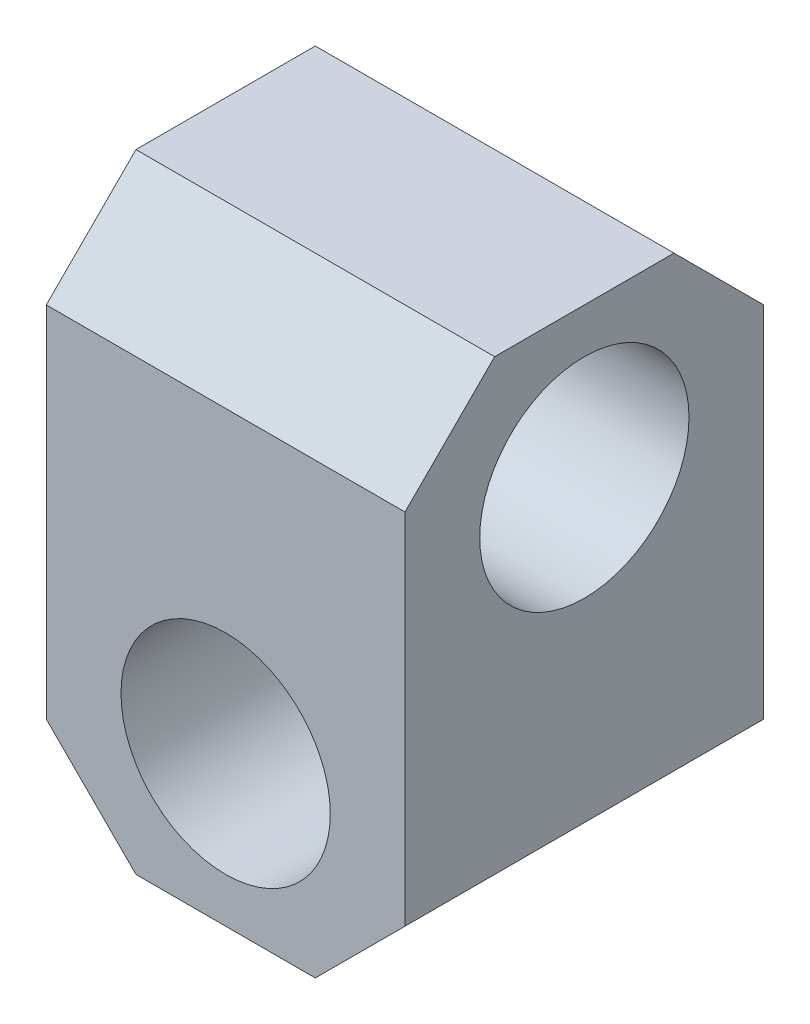
ISO-10303-21;
HEADER;
FILE_DESCRIPTION(('STEP AP214'),'2;1');
FILE_NAME('part.step','',(''),(''),'','','');
FILE_SCHEMA(('AUTOMOTIVE_DESIGN { 1 0 10303 214 1 1 1 1 }'));
ENDSEC;
DATA;
#1=APPLICATION_CONTEXT('core data for automotive mechanical design processes');
#2=APPLICATION_PROTOCOL_DEFINITION('international standard','automotive_design',2000,#1);
#3=PRODUCT_CONTEXT('',#1,'mechanical');
#4=PRODUCT('Part','Part','',(#3));
#5=PRODUCT_RELATED_PRODUCT_CATEGORY('part','',(#4));
#6=PRODUCT_DEFINITION_FORMATION('','',#4);
#7=PRODUCT_DEFINITION_CONTEXT('part definition',#1,'design');
#8=PRODUCT_DEFINITION('design','',#6,#7);
#9=PRODUCT_DEFINITION_SHAPE('','',#8);
#10=(LENGTH_UNIT() NAMED_UNIT(*) SI_UNIT(.MILLI.,.METRE.));
#11=(NAMED_UNIT(*) PLANE_ANGLE_UNIT() SI_UNIT($,.RADIAN.));
#12=(NAMED_UNIT(*) SI_UNIT($,.STERADIAN.) SOLID_ANGLE_UNIT());
#13=UNCERTAINTY_MEASURE_WITH_UNIT(LENGTH_MEASURE(1.E-05),#10,'distance_accuracy_value','');
#14=(GEOMETRIC_REPRESENTATION_CONTEXT(3) GLOBAL_UNCERTAINTY_ASSIGNED_CONTEXT((#13)) GLOBAL_UNIT_ASSIGNED_CONTEXT((#10,
#11,#12)) REPRESENTATION_CONTEXT('',''));
#15=CARTESIAN_POINT('',(0.,0.,0.));
#16=DIRECTION('',(0.,0.,1.));
#17=DIRECTION('',(1.,0.,0.));
#18=AXIS2_PLACEMENT_3D('',#15,#16,#17);
#19=CARTESIAN_POINT('',(3.,4.5,3.));
#20=DIRECTION('',(-1.,0.,0.));
#21=DIRECTION('',(0.,0.,1.));
#22=AXIS2_PLACEMENT_3D('',#19,#20,#21);
#23=PLANE('',#22);
#24=CARTESIAN_POINT('',(3.,2.,0.));
#25=DIRECTION('',(-1.,0.,0.));
#26=DIRECTION('',(0.,0.,1.));
#27=AXIS2_PLACEMENT_3D('',#24,#25,#26);
#28=CIRCLE('',#27,1.75);
#29=CARTESIAN_POINT('',(3.,2.,1.75));
#30=VERTEX_POINT('',#29);
#31=EDGE_CURVE('E233',#30,#30,#28,.T.);
#32=ORIENTED_EDGE('',*,*,#31,.T.);
#33=EDGE_LOOP('',(#32));
#34=FACE_BOUND('',#33,.T.);
#35=DIRECTION('',(0.,-1.,0.));
#36=VECTOR('',#35,1.);
#37=CARTESIAN_POINT('',(3.,4.5,-3.));
#38=LINE('',#37,#36);
#39=CARTESIAN_POINT('',(3.,3.,-3.));
#40=VERTEX_POINT('',#39);
#41=CARTESIAN_POINT('',(3.,-3.,-3.));
#42=VERTEX_POINT('',#41);
#43=EDGE_CURVE('E124',#40,#42,#38,.T.);
#44=ORIENTED_EDGE('',*,*,#43,.F.);
#45=DIRECTION('',(0.,-0.707106781186549,-0.707106781186546));
#46=VECTOR('',#45,1.);
#47=CARTESIAN_POINT('',(3.,4.5,-1.5));
#48=LINE('',#47,#46);
#49=CARTESIAN_POINT('',(3.,4.5,-1.5));
#50=VERTEX_POINT('',#49);
#51=EDGE_CURVE('E111',#40,#50,#48,.F.);
#52=ORIENTED_EDGE('',*,*,#51,.T.);
#53=DIRECTION('',(0.,0.,-1.));
#54=VECTOR('',#53,1.);
#55=CARTESIAN_POINT('',(3.,4.5,3.));
#56=LINE('',#55,#54);
#57=CARTESIAN_POINT('',(3.,4.5,1.5));
#58=VERTEX_POINT('',#57);
#59=EDGE_CURVE('E119',#58,#50,#56,.T.);
#60=ORIENTED_EDGE('',*,*,#59,.F.);
#61=DIRECTION('',(0.,0.707106781186549,-0.707106781186546));
#62=VECTOR('',#61,1.);
#63=CARTESIAN_POINT('',(3.,4.5,1.5));
#64=LINE('',#63,#62);
#65=CARTESIAN_POINT('',(3.,3.,3.));
#66=VERTEX_POINT('',#65);
#67=EDGE_CURVE('E101',#58,#66,#64,.F.);
#68=ORIENTED_EDGE('',*,*,#67,.T.);
#69=DIRECTION('',(0.,-1.,0.));
#70=VECTOR('',#69,1.);
#71=CARTESIAN_POINT('',(3.,4.5,3.));
#72=LINE('',#71,#70);
#73=CARTESIAN_POINT('',(3.,-3.,3.));
#74=VERTEX_POINT('',#73);
#75=EDGE_CURVE('E130',#66,#74,#72,.T.);
#76=ORIENTED_EDGE('',*,*,#75,.T.);
#77=DIRECTION('',(0.,0.,-1.));
#78=VECTOR('',#77,1.);
#79=CARTESIAN_POINT('',(3.,-3.,-3.));
#80=LINE('',#79,#78);
#81=EDGE_CURVE('E112',#74,#42,#80,.T.);
#82=ORIENTED_EDGE('',*,*,#81,.T.);
#83=EDGE_LOOP('',(#44,#52,#60,#68,#76,#82));
#84=FACE_BOUND('',#83,.T.);
#85=ADVANCED_FACE('F37',(#34,#84),#23,.F.);
#86=CARTESIAN_POINT('',(-3.,4.5,-3.));
#87=DIRECTION('',(0.,0.,1.));
#88=DIRECTION('',(1.,0.,0.));
#89=AXIS2_PLACEMENT_3D('',#86,#87,#88);
#90=PLANE('',#89);
#91=CARTESIAN_POINT('',(0.,-2.,-3.));
#92=DIRECTION('',(0.,0.,1.));
#93=DIRECTION('',(1.,0.,0.));
#94=AXIS2_PLACEMENT_3D('',#91,#92,#93);
#95=CIRCLE('',#94,1.75);
#96=CARTESIAN_POINT('',(1.75,-2.,-3.));
#97=VERTEX_POINT('',#96);
#98=EDGE_CURVE('E135',#97,#97,#95,.T.);
#99=ORIENTED_EDGE('',*,*,#98,.T.);
#100=EDGE_LOOP('',(#99));
#101=FACE_BOUND('',#100,.T.);
#102=DIRECTION('',(0.,-1.,0.));
#103=VECTOR('',#102,1.);
#104=CARTESIAN_POINT('',(-3.,4.5,-3.));
#105=LINE('',#104,#103);
#106=CARTESIAN_POINT('',(-3.,3.,-3.));
#107=VERTEX_POINT('',#106);
#108=CARTESIAN_POINT('',(-3.,-3.,-3.));
#109=VERTEX_POINT('',#108);
#110=EDGE_CURVE('E143',#107,#109,#105,.T.);
#111=ORIENTED_EDGE('',*,*,#110,.F.);
#112=DIRECTION('',(1.,0.,0.));
#113=VECTOR('',#112,1.);
#114=CARTESIAN_POINT('',(-3.,3.,-3.));
#115=LINE('',#114,#113);
#116=EDGE_CURVE('E160',#107,#40,#115,.T.);
#117=ORIENTED_EDGE('',*,*,#116,.T.);
#118=ORIENTED_EDGE('',*,*,#43,.T.);
#119=DIRECTION('',(-0.707106781186549,-0.707106781186546,0.));
#120=VECTOR('',#119,1.);
#121=CARTESIAN_POINT('',(3.,-3.,-3.));
#122=LINE('',#121,#120);
#123=CARTESIAN_POINT('',(1.49999999999999,-4.5,-3.));
#124=VERTEX_POINT('',#123);
#125=EDGE_CURVE('E158',#42,#124,#122,.T.);
#126=ORIENTED_EDGE('',*,*,#125,.T.);
#127=DIRECTION('',(-1.,0.,0.));
#128=VECTOR('',#127,1.);
#129=CARTESIAN_POINT('',(-3.,-4.5,-3.));
#130=LINE('',#129,#128);
#131=CARTESIAN_POINT('',(-1.49999999999999,-4.5,-3.));
#132=VERTEX_POINT('',#131);
#133=EDGE_CURVE('E132',#124,#132,#130,.T.);
#134=ORIENTED_EDGE('',*,*,#133,.T.);
#135=DIRECTION('',(-0.707106781186549,0.707106781186546,0.));
#136=VECTOR('',#135,1.);
#137=CARTESIAN_POINT('',(-3.,-3.,-3.));
#138=LINE('',#137,#136);
#139=EDGE_CURVE('E156',#132,#109,#138,.T.);
#140=ORIENTED_EDGE('',*,*,#139,.T.);
#141=EDGE_LOOP('',(#111,#117,#118,#126,#134,#140));
#142=FACE_BOUND('',#141,.T.);
#143=ADVANCED_FACE('F174',(#101,#142),#90,.F.);
#144=CARTESIAN_POINT('',(-3.,4.5,3.));
#145=DIRECTION('',(1.,0.,0.));
#146=DIRECTION('',(0.,0.,-1.));
#147=AXIS2_PLACEMENT_3D('',#144,#145,#146);
#148=PLANE('',#147);
#149=CARTESIAN_POINT('',(-3.,2.,0.));
#150=DIRECTION('',(-1.,0.,0.));
#151=DIRECTION('',(0.,0.,1.));
#152=AXIS2_PLACEMENT_3D('',#149,#150,#151);
#153=CIRCLE('',#152,1.75);
#154=CARTESIAN_POINT('',(-3.,2.,1.75));
#155=VERTEX_POINT('',#154);
#156=EDGE_CURVE('E232',#155,#155,#153,.T.);
#157=ORIENTED_EDGE('',*,*,#156,.F.);
#158=EDGE_LOOP('',(#157));
#159=FACE_BOUND('',#158,.T.);
#160=DIRECTION('',(0.,0.,1.));
#161=VECTOR('',#160,1.);
#162=CARTESIAN_POINT('',(-3.,4.5,3.));
#163=LINE('',#162,#161);
#164=CARTESIAN_POINT('',(-3.,4.5,-1.5));
#165=VERTEX_POINT('',#164);
#166=CARTESIAN_POINT('',(-3.,4.5,1.5));
#167=VERTEX_POINT('',#166);
#168=EDGE_CURVE('E122',#165,#167,#163,.T.);
#169=ORIENTED_EDGE('',*,*,#168,.F.);
#170=DIRECTION('',(0.,0.707106781186549,0.707106781186546));
#171=VECTOR('',#170,1.);
#172=CARTESIAN_POINT('',(-3.,4.5,-1.5));
#173=LINE('',#172,#171);
#174=EDGE_CURVE('E154',#165,#107,#173,.F.);
#175=ORIENTED_EDGE('',*,*,#174,.T.);
#176=ORIENTED_EDGE('',*,*,#110,.T.);
#177=DIRECTION('',(0.,0.,1.));
#178=VECTOR('',#177,1.);
#179=CARTESIAN_POINT('',(-3.,-3.,3.));
#180=LINE('',#179,#178);
#181=CARTESIAN_POINT('',(-3.,-3.,3.));
#182=VERTEX_POINT('',#181);
#183=EDGE_CURVE('E149',#109,#182,#180,.T.);
#184=ORIENTED_EDGE('',*,*,#183,.T.);
#185=DIRECTION('',(0.,-1.,0.));
#186=VECTOR('',#185,1.);
#187=CARTESIAN_POINT('',(-3.,4.5,3.));
#188=LINE('',#187,#186);
#189=CARTESIAN_POINT('',(-3.,3.,3.));
#190=VERTEX_POINT('',#189);
#191=EDGE_CURVE('E141',#190,#182,#188,.T.);
#192=ORIENTED_EDGE('',*,*,#191,.F.);
#193=DIRECTION('',(0.,-0.707106781186549,0.707106781186546));
#194=VECTOR('',#193,1.);
#195=CARTESIAN_POINT('',(-3.,4.5,1.5));
#196=LINE('',#195,#194);
#197=EDGE_CURVE('E152',#190,#167,#196,.F.);
#198=ORIENTED_EDGE('',*,*,#197,.T.);
#199=EDGE_LOOP('',(#169,#175,#176,#184,#192,#198));
#200=FACE_BOUND('',#199,.T.);
#201=ADVANCED_FACE('F178',(#159,#200),#148,.F.);
#202=CARTESIAN_POINT('',(-3.,4.5,3.));
#203=DIRECTION('',(0.,0.,-1.));
#204=DIRECTION('',(-1.,0.,0.));
#205=AXIS2_PLACEMENT_3D('',#202,#203,#204);
#206=PLANE('',#205);
#207=CARTESIAN_POINT('',(0.,-2.,3.));
#208=DIRECTION('',(0.,0.,1.));
#209=DIRECTION('',(1.,0.,0.));
#210=AXIS2_PLACEMENT_3D('',#207,#208,#209);
#211=CIRCLE('',#210,1.75);
#212=CARTESIAN_POINT('',(1.75,-2.,3.));
#213=VERTEX_POINT('',#212);
#214=EDGE_CURVE('E235',#213,#213,#211,.T.);
#215=ORIENTED_EDGE('',*,*,#214,.F.);
#216=EDGE_LOOP('',(#215));
#217=FACE_BOUND('',#216,.T.);
#218=ORIENTED_EDGE('',*,*,#75,.F.);
#219=DIRECTION('',(-1.,0.,0.));
#220=VECTOR('',#219,1.);
#221=CARTESIAN_POINT('',(-3.,3.,3.));
#222=LINE('',#221,#220);
#223=EDGE_CURVE('E106',#66,#190,#222,.T.);
#224=ORIENTED_EDGE('',*,*,#223,.T.);
#225=ORIENTED_EDGE('',*,*,#191,.T.);
#226=DIRECTION('',(0.707106781186549,-0.707106781186546,0.));
#227=VECTOR('',#226,1.);
#228=CARTESIAN_POINT('',(-3.,-3.,3.));
#229=LINE('',#228,#227);
#230=CARTESIAN_POINT('',(-1.49999999999999,-4.5,3.));
#231=VERTEX_POINT('',#230);
#232=EDGE_CURVE('E57',#182,#231,#229,.T.);
#233=ORIENTED_EDGE('',*,*,#232,.T.);
#234=DIRECTION('',(1.,0.,0.));
#235=VECTOR('',#234,1.);
#236=CARTESIAN_POINT('',(-3.,-4.5,3.));
#237=LINE('',#236,#235);
#238=CARTESIAN_POINT('',(1.49999999999999,-4.5,3.));
#239=VERTEX_POINT('',#238);
#240=EDGE_CURVE('E128',#231,#239,#237,.T.);
#241=ORIENTED_EDGE('',*,*,#240,.T.);
#242=DIRECTION('',(0.707106781186549,0.707106781186546,0.));
#243=VECTOR('',#242,1.);
#244=CARTESIAN_POINT('',(3.,-3.,3.));
#245=LINE('',#244,#243);
#246=EDGE_CURVE('E166',#239,#74,#245,.T.);
#247=ORIENTED_EDGE('',*,*,#246,.T.);
#248=EDGE_LOOP('',(#218,#224,#225,#233,#241,#247));
#249=FACE_BOUND('',#248,.T.);
#250=ADVANCED_FACE('F179',(#217,#249),#206,.F.);
#251=CARTESIAN_POINT('',(0.,4.5,0.));
#252=DIRECTION('',(0.,-1.,0.));
#253=DIRECTION('',(0.,0.,-1.));
#254=AXIS2_PLACEMENT_3D('',#251,#252,#253);
#255=PLANE('',#254);
#256=ORIENTED_EDGE('',*,*,#59,.T.);
#257=DIRECTION('',(-1.,0.,0.));
#258=VECTOR('',#257,1.);
#259=CARTESIAN_POINT('',(0.,4.5,-1.5));
#260=LINE('',#259,#258);
#261=EDGE_CURVE('E123',#50,#165,#260,.T.);
#262=ORIENTED_EDGE('',*,*,#261,.T.);
#263=ORIENTED_EDGE('',*,*,#168,.T.);
#264=DIRECTION('',(1.,0.,0.));
#265=VECTOR('',#264,1.);
#266=CARTESIAN_POINT('',(0.,4.5,1.5));
#267=LINE('',#266,#265);
#268=EDGE_CURVE('E105',#167,#58,#267,.T.);
#269=ORIENTED_EDGE('',*,*,#268,.T.);
#270=EDGE_LOOP('',(#256,#262,#263,#269));
#271=FACE_BOUND('',#270,.T.);
#272=ADVANCED_FACE('F117',(#271),#255,.F.);
#273=CARTESIAN_POINT('',(0.,-4.5,0.));
#274=DIRECTION('',(0.,-1.,0.));
#275=DIRECTION('',(0.,0.,-1.));
#276=AXIS2_PLACEMENT_3D('',#273,#274,#275);
#277=PLANE('',#276);
#278=ORIENTED_EDGE('',*,*,#133,.F.);
#279=DIRECTION('',(0.,0.,1.));
#280=VECTOR('',#279,1.);
#281=CARTESIAN_POINT('',(1.49999999999999,-4.5,3.));
#282=LINE('',#281,#280);
#283=EDGE_CURVE('E11',#124,#239,#282,.T.);
#284=ORIENTED_EDGE('',*,*,#283,.T.);
#285=ORIENTED_EDGE('',*,*,#240,.F.);
#286=DIRECTION('',(0.,0.,-1.));
#287=VECTOR('',#286,1.);
#288=CARTESIAN_POINT('',(-1.49999999999999,-4.5,-3.));
#289=LINE('',#288,#287);
#290=EDGE_CURVE('E45',#231,#132,#289,.T.);
#291=ORIENTED_EDGE('',*,*,#290,.T.);
#292=EDGE_LOOP('',(#278,#284,#285,#291));
#293=FACE_BOUND('',#292,.T.);
#294=ADVANCED_FACE('F169',(#293),#277,.T.);
#295=CARTESIAN_POINT('',(0.,-2.,-3.));
#296=DIRECTION('',(0.,0.,1.));
#297=DIRECTION('',(1.,0.,0.));
#298=AXIS2_PLACEMENT_3D('',#295,#296,#297);
#299=CYLINDRICAL_SURFACE('',#298,1.75);
#300=CARTESIAN_POINT('',(1.75,-2.,-3.));
#301=CARTESIAN_POINT('',(1.75,-2.,-2.9375));
#302=CARTESIAN_POINT('',(1.75,-2.,-2.875));
#303=CARTESIAN_POINT('',(1.75,-2.,-2.75));
#304=CARTESIAN_POINT('',(1.75,-2.,-2.6875));
#305=CARTESIAN_POINT('',(1.75,-2.,-2.5625));
#306=CARTESIAN_POINT('',(1.75,-2.,-2.5));
#307=CARTESIAN_POINT('',(1.75,-2.,-2.375));
#308=CARTESIAN_POINT('',(1.75,-2.,-2.3125));
#309=CARTESIAN_POINT('',(1.75,-2.,-2.1875));
#310=CARTESIAN_POINT('',(1.75,-2.,-2.125));
#311=CARTESIAN_POINT('',(1.75,-2.,-2.));
#312=CARTESIAN_POINT('',(1.75,-2.,-1.9375));
#313=CARTESIAN_POINT('',(1.75,-2.,-1.8125));
#314=CARTESIAN_POINT('',(1.75,-2.,-1.75));
#315=CARTESIAN_POINT('',(1.75,-2.,-1.625));
#316=CARTESIAN_POINT('',(1.75,-2.,-1.5625));
#317=CARTESIAN_POINT('',(1.75,-2.,-1.4375));
#318=CARTESIAN_POINT('',(1.75,-2.,-1.375));
#319=CARTESIAN_POINT('',(1.75,-2.,-1.25));
#320=CARTESIAN_POINT('',(1.75,-2.,-1.1875));
#321=CARTESIAN_POINT('',(1.75,-2.,-1.0625));
#322=CARTESIAN_POINT('',(1.75,-2.,-1.));
#323=CARTESIAN_POINT('',(1.75,-2.,-0.875000000000001));
#324=CARTESIAN_POINT('',(1.75,-2.,-0.812500000000001));
#325=CARTESIAN_POINT('',(1.75,-2.,-0.687500000000001));
#326=CARTESIAN_POINT('',(1.75,-2.,-0.625000000000001));
#327=CARTESIAN_POINT('',(1.75,-2.,-0.500000000000001));
#328=CARTESIAN_POINT('',(1.75,-2.,-0.437500000000001));
#329=CARTESIAN_POINT('',(1.75,-2.,-0.312500000000001));
#330=CARTESIAN_POINT('',(1.75,-2.,-0.250000000000001));
#331=CARTESIAN_POINT('',(1.75,-2.,-0.125000000000001));
#332=CARTESIAN_POINT('',(1.75,-2.,-0.0625000000000009));
#333=CARTESIAN_POINT('',(1.75,-2.,0.0624999999999992));
#334=CARTESIAN_POINT('',(1.75,-2.,0.124999999999999));
#335=CARTESIAN_POINT('',(1.75,-2.,0.249999999999999));
#336=CARTESIAN_POINT('',(1.75,-2.,0.312499999999999));
#337=CARTESIAN_POINT('',(1.75,-2.,0.437499999999999));
#338=CARTESIAN_POINT('',(1.75,-2.,0.499999999999999));
#339=CARTESIAN_POINT('',(1.75,-2.,0.624999999999999));
#340=CARTESIAN_POINT('',(1.75,-2.,0.687499999999999));
#341=CARTESIAN_POINT('',(1.75,-2.,0.812499999999999));
#342=CARTESIAN_POINT('',(1.75,-2.,0.874999999999999));
#343=CARTESIAN_POINT('',(1.75,-2.,0.999999999999999));
#344=CARTESIAN_POINT('',(1.75,-2.,1.0625));
#345=CARTESIAN_POINT('',(1.75,-2.,1.1875));
#346=CARTESIAN_POINT('',(1.75,-2.,1.25));
#347=CARTESIAN_POINT('',(1.75,-2.,1.375));
#348=CARTESIAN_POINT('',(1.75,-2.,1.4375));
#349=CARTESIAN_POINT('',(1.75,-2.,1.5625));
#350=CARTESIAN_POINT('',(1.75,-2.,1.625));
#351=CARTESIAN_POINT('',(1.75,-2.,1.75));
#352=CARTESIAN_POINT('',(1.75,-2.,1.8125));
#353=CARTESIAN_POINT('',(1.75,-2.,1.9375));
#354=CARTESIAN_POINT('',(1.75,-2.,2.));
#355=CARTESIAN_POINT('',(1.75,-2.,2.125));
#356=CARTESIAN_POINT('',(1.75,-2.,2.1875));
#357=CARTESIAN_POINT('',(1.75,-2.,2.3125));
#358=CARTESIAN_POINT('',(1.75,-2.,2.375));
#359=CARTESIAN_POINT('',(1.75,-2.,2.5));
#360=CARTESIAN_POINT('',(1.75,-2.,2.5625));
#361=CARTESIAN_POINT('',(1.75,-2.,2.6875));
#362=CARTESIAN_POINT('',(1.75,-2.,2.75));
#363=CARTESIAN_POINT('',(1.75,-2.,2.875));
#364=CARTESIAN_POINT('',(1.75,-2.,2.9375));
#365=CARTESIAN_POINT('',(1.75,-2.,3.));
#366=B_SPLINE_CURVE_WITH_KNOTS('',3,(#300,#301,#302,#303,#304,#305,#306,#307,#308,#309,#310,
#311,#312,#313,#314,#315,#316,#317,#318,#319,#320,#321,#322,#323,#324,#325,#326,#327,#328,#329,
#330,#331,#332,#333,#334,#335,#336,#337,#338,#339,#340,#341,#342,#343,#344,#345,#346,#347,#348,
#349,#350,#351,#352,#353,#354,#355,#356,#357,#358,#359,#360,#361,#362,#363,#364,#365),
.UNSPECIFIED.,.F.,.F.,(4,2,2,2,2,2,2,2,2,2,2,2,2,2,2,2,2,2,2,2,2,2,2,2,2,2,2,2,2,2,2,2,4),(0.,
0.1875,0.375,0.5625,0.75,0.9375,1.125,1.3125,1.5,1.6875,1.875,2.0625,2.25,2.4375,2.625,2.8125,
3.,3.1875,3.375,3.5625,3.75,3.9375,4.125,4.3125,4.5,4.6875,4.875,5.0625,5.25,5.4375,5.625,
5.8125,6.),.UNSPECIFIED.);
#367=EDGE_CURVE('BSEAM208',#97,#213,#366,.T.);
#368=ORIENTED_EDGE('',*,*,#98,.F.);
#369=ORIENTED_EDGE('',*,*,#214,.T.);
#370=ORIENTED_EDGE('',*,*,#367,.T.);
#371=ORIENTED_EDGE('',*,*,#367,.F.);
#372=EDGE_LOOP('',(#368,#370,#369,#371));
#373=FACE_BOUND('',#372,.T.);
#374=ADVANCED_FACE('F208',(#373),#299,.F.);
#375=CARTESIAN_POINT('',(3.,2.,0.));
#376=DIRECTION('',(-1.,0.,0.));
#377=DIRECTION('',(0.,0.,1.));
#378=AXIS2_PLACEMENT_3D('',#375,#376,#377);
#379=CYLINDRICAL_SURFACE('',#378,1.75);
#380=ORIENTED_EDGE('',*,*,#31,.F.);
#381=EDGE_LOOP('',(#380));
#382=FACE_BOUND('',#381,.T.);
#383=ORIENTED_EDGE('',*,*,#156,.T.);
#384=EDGE_LOOP('',(#383));
#385=FACE_BOUND('',#384,.T.);
#386=ADVANCED_FACE('F203',(#382,#385),#379,.F.);
#387=CARTESIAN_POINT('',(0.,4.5,-1.5));
#388=DIRECTION('',(0.,-0.707106781186546,0.707106781186549));
#389=DIRECTION('',(-1.,0.,0.));
#390=AXIS2_PLACEMENT_3D('',#387,#388,#389);
#391=PLANE('',#390);
#392=ORIENTED_EDGE('',*,*,#51,.F.);
#393=ORIENTED_EDGE('',*,*,#116,.F.);
#394=ORIENTED_EDGE('',*,*,#174,.F.);
#395=ORIENTED_EDGE('',*,*,#261,.F.);
#396=EDGE_LOOP('',(#392,#393,#394,#395));
#397=FACE_BOUND('',#396,.T.);
#398=ADVANCED_FACE('F189',(#397),#391,.F.);
#399=CARTESIAN_POINT('',(0.,4.5,1.5));
#400=DIRECTION('',(0.,-0.707106781186546,-0.707106781186549));
#401=DIRECTION('',(1.,0.,0.));
#402=AXIS2_PLACEMENT_3D('',#399,#400,#401);
#403=PLANE('',#402);
#404=ORIENTED_EDGE('',*,*,#197,.F.);
#405=ORIENTED_EDGE('',*,*,#223,.F.);
#406=ORIENTED_EDGE('',*,*,#67,.F.);
#407=ORIENTED_EDGE('',*,*,#268,.F.);
#408=EDGE_LOOP('',(#404,#405,#406,#407));
#409=FACE_BOUND('',#408,.T.);
#410=ADVANCED_FACE('F104',(#409),#403,.F.);
#411=CARTESIAN_POINT('',(3.,-3.,3.));
#412=DIRECTION('',(0.707106781186546,-0.707106781186549,0.));
#413=DIRECTION('',(0.,0.,1.));
#414=AXIS2_PLACEMENT_3D('',#411,#412,#413);
#415=PLANE('',#414);
#416=ORIENTED_EDGE('',*,*,#246,.F.);
#417=ORIENTED_EDGE('',*,*,#283,.F.);
#418=ORIENTED_EDGE('',*,*,#125,.F.);
#419=ORIENTED_EDGE('',*,*,#81,.F.);
#420=EDGE_LOOP('',(#416,#417,#418,#419));
#421=FACE_BOUND('',#420,.T.);
#422=ADVANCED_FACE('F183',(#421),#415,.T.);
#423=CARTESIAN_POINT('',(-3.,-3.,3.));
#424=DIRECTION('',(-0.707106781186546,-0.707106781186549,0.));
#425=DIRECTION('',(0.,0.,-1.));
#426=AXIS2_PLACEMENT_3D('',#423,#424,#425);
#427=PLANE('',#426);
#428=ORIENTED_EDGE('',*,*,#139,.F.);
#429=ORIENTED_EDGE('',*,*,#290,.F.);
#430=ORIENTED_EDGE('',*,*,#232,.F.);
#431=ORIENTED_EDGE('',*,*,#183,.F.);
#432=EDGE_LOOP('',(#428,#429,#430,#431));
#433=FACE_BOUND('',#432,.T.);
#434=ADVANCED_FACE('F39',(#433),#427,.T.);
#435=CLOSED_SHELL('',(#85,#143,#201,#250,#272,#294,#374,#386,#398,#410,#422,#434));
#436=MANIFOLD_SOLID_BREP('B2',#435);
#437=ADVANCED_BREP_SHAPE_REPRESENTATION('',(#18,#436),#14);
#438=SHAPE_DEFINITION_REPRESENTATION(#9,#437);
ENDSEC;
END-ISO-10303-21;
